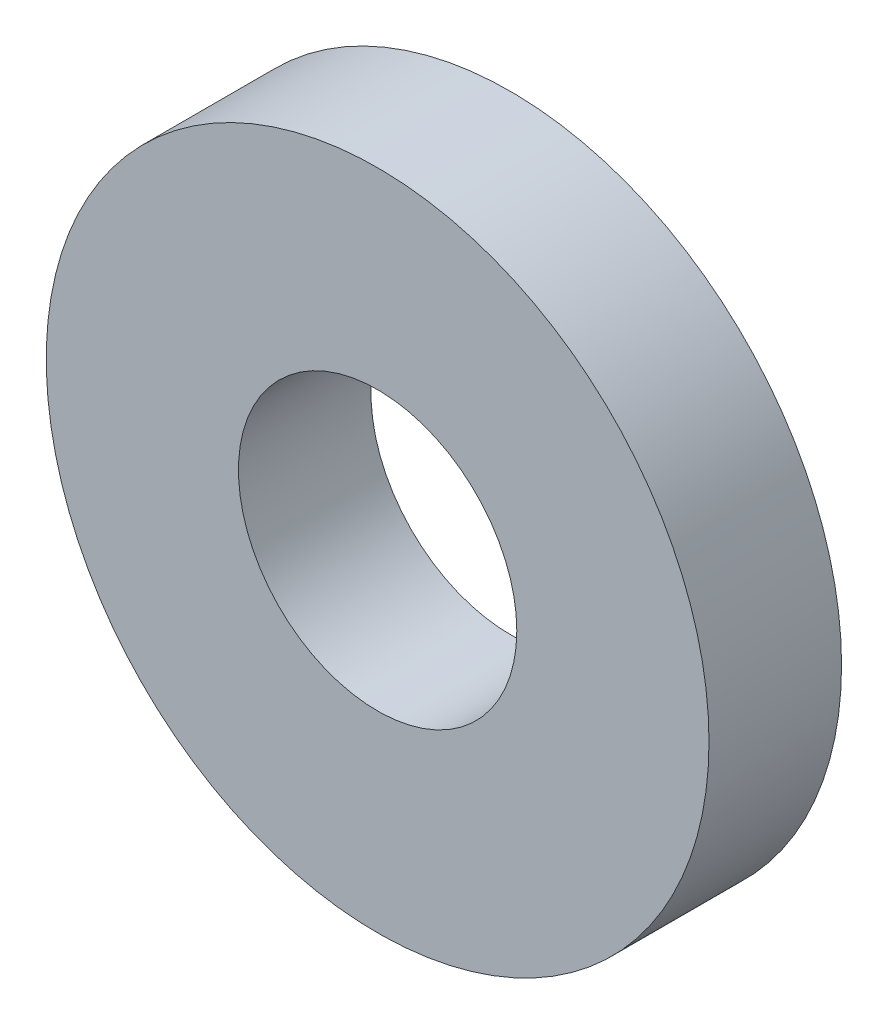
ISO-10303-21;
HEADER;
FILE_DESCRIPTION(('STEP AP214'),'2;1');
FILE_NAME('part.step','',(''),(''),'','','');
FILE_SCHEMA(('AUTOMOTIVE_DESIGN { 1 0 10303 214 1 1 1 1 }'));
ENDSEC;
DATA;
#1=APPLICATION_CONTEXT('core data for automotive mechanical design processes');
#2=APPLICATION_PROTOCOL_DEFINITION('international standard','automotive_design',2000,#1);
#3=PRODUCT_CONTEXT('',#1,'mechanical');
#4=PRODUCT('Part','Part','',(#3));
#5=PRODUCT_RELATED_PRODUCT_CATEGORY('part','',(#4));
#6=PRODUCT_DEFINITION_FORMATION('','',#4);
#7=PRODUCT_DEFINITION_CONTEXT('part definition',#1,'design');
#8=PRODUCT_DEFINITION('design','',#6,#7);
#9=PRODUCT_DEFINITION_SHAPE('','',#8);
#10=(LENGTH_UNIT() NAMED_UNIT(*) SI_UNIT(.MILLI.,.METRE.));
#11=(NAMED_UNIT(*) PLANE_ANGLE_UNIT() SI_UNIT($,.RADIAN.));
#12=(NAMED_UNIT(*) SI_UNIT($,.STERADIAN.) SOLID_ANGLE_UNIT());
#13=UNCERTAINTY_MEASURE_WITH_UNIT(LENGTH_MEASURE(1.E-05),#10,'distance_accuracy_value','');
#14=(GEOMETRIC_REPRESENTATION_CONTEXT(3) GLOBAL_UNCERTAINTY_ASSIGNED_CONTEXT((#13)) GLOBAL_UNIT_ASSIGNED_CONTEXT((#10,
#11,#12)) REPRESENTATION_CONTEXT('',''));
#15=CARTESIAN_POINT('',(0.,0.,0.));
#16=DIRECTION('',(0.,0.,1.));
#17=DIRECTION('',(1.,0.,0.));
#18=AXIS2_PLACEMENT_3D('',#15,#16,#17);
#19=CARTESIAN_POINT('',(0.,0.,2.));
#20=DIRECTION('',(0.,0.,1.));
#21=DIRECTION('',(1.,0.,0.));
#22=AXIS2_PLACEMENT_3D('',#19,#20,#21);
#23=PLANE('',#22);
#24=CARTESIAN_POINT('',(0.,0.,2.));
#25=DIRECTION('',(0.,0.,1.));
#26=DIRECTION('',(1.,0.,0.));
#27=AXIS2_PLACEMENT_3D('',#24,#25,#26);
#28=CIRCLE('',#27,5.);
#29=CARTESIAN_POINT('',(5.,0.,2.));
#30=VERTEX_POINT('',#29);
#31=EDGE_CURVE('E10',#30,#30,#28,.T.);
#32=ORIENTED_EDGE('',*,*,#31,.T.);
#33=EDGE_LOOP('',(#32));
#34=FACE_BOUND('',#33,.T.);
#35=CARTESIAN_POINT('',(0.,0.,2.));
#36=DIRECTION('',(0.,0.,1.));
#37=DIRECTION('',(1.,0.,0.));
#38=AXIS2_PLACEMENT_3D('',#35,#36,#37);
#39=CIRCLE('',#38,2.1);
#40=CARTESIAN_POINT('',(2.1,0.,2.));
#41=VERTEX_POINT('',#40);
#42=EDGE_CURVE('E44',#41,#41,#39,.T.);
#43=ORIENTED_EDGE('',*,*,#42,.F.);
#44=EDGE_LOOP('',(#43));
#45=FACE_BOUND('',#44,.T.);
#46=ADVANCED_FACE('F33',(#34,#45),#23,.T.);
#47=CARTESIAN_POINT('',(0.,0.,0.));
#48=DIRECTION('',(0.,0.,1.));
#49=DIRECTION('',(1.,0.,0.));
#50=AXIS2_PLACEMENT_3D('',#47,#48,#49);
#51=PLANE('',#50);
#52=CARTESIAN_POINT('',(0.,0.,0.));
#53=DIRECTION('',(0.,0.,1.));
#54=DIRECTION('',(1.,0.,0.));
#55=AXIS2_PLACEMENT_3D('',#52,#53,#54);
#56=CIRCLE('',#55,5.);
#57=CARTESIAN_POINT('',(5.,0.,0.));
#58=VERTEX_POINT('',#57);
#59=EDGE_CURVE('E37',#58,#58,#56,.T.);
#60=ORIENTED_EDGE('',*,*,#59,.F.);
#61=EDGE_LOOP('',(#60));
#62=FACE_BOUND('',#61,.T.);
#63=CARTESIAN_POINT('',(0.,0.,0.));
#64=DIRECTION('',(0.,0.,1.));
#65=DIRECTION('',(1.,0.,0.));
#66=AXIS2_PLACEMENT_3D('',#63,#64,#65);
#67=CIRCLE('',#66,2.1);
#68=CARTESIAN_POINT('',(2.1,0.,0.));
#69=VERTEX_POINT('',#68);
#70=EDGE_CURVE('E46',#69,#69,#67,.T.);
#71=ORIENTED_EDGE('',*,*,#70,.T.);
#72=EDGE_LOOP('',(#71));
#73=FACE_BOUND('',#72,.T.);
#74=ADVANCED_FACE('F56',(#62,#73),#51,.F.);
#75=CARTESIAN_POINT('',(0.,0.,2.));
#76=DIRECTION('',(0.,0.,-1.));
#77=DIRECTION('',(-1.,0.,0.));
#78=AXIS2_PLACEMENT_3D('',#75,#76,#77);
#79=CYLINDRICAL_SURFACE('',#78,5.);
#80=ORIENTED_EDGE('',*,*,#31,.F.);
#81=EDGE_LOOP('',(#80));
#82=FACE_BOUND('',#81,.T.);
#83=ORIENTED_EDGE('',*,*,#59,.T.);
#84=EDGE_LOOP('',(#83));
#85=FACE_BOUND('',#84,.T.);
#86=ADVANCED_FACE('F35',(#82,#85),#79,.T.);
#87=CARTESIAN_POINT('',(0.,0.,2.));
#88=DIRECTION('',(0.,0.,-1.));
#89=DIRECTION('',(-1.,0.,0.));
#90=AXIS2_PLACEMENT_3D('',#87,#88,#89);
#91=CYLINDRICAL_SURFACE('',#90,2.1);
#92=ORIENTED_EDGE('',*,*,#42,.T.);
#93=EDGE_LOOP('',(#92));
#94=FACE_BOUND('',#93,.T.);
#95=ORIENTED_EDGE('',*,*,#70,.F.);
#96=EDGE_LOOP('',(#95));
#97=FACE_BOUND('',#96,.T.);
#98=ADVANCED_FACE('F52',(#94,#97),#91,.F.);
#99=CLOSED_SHELL('',(#46,#74,#86,#98));
#100=MANIFOLD_SOLID_BREP('B2',#99);
#101=ADVANCED_BREP_SHAPE_REPRESENTATION('',(#18,#100),#14);
#102=SHAPE_DEFINITION_REPRESENTATION(#9,#101);
ENDSEC;
END-ISO-10303-21;
